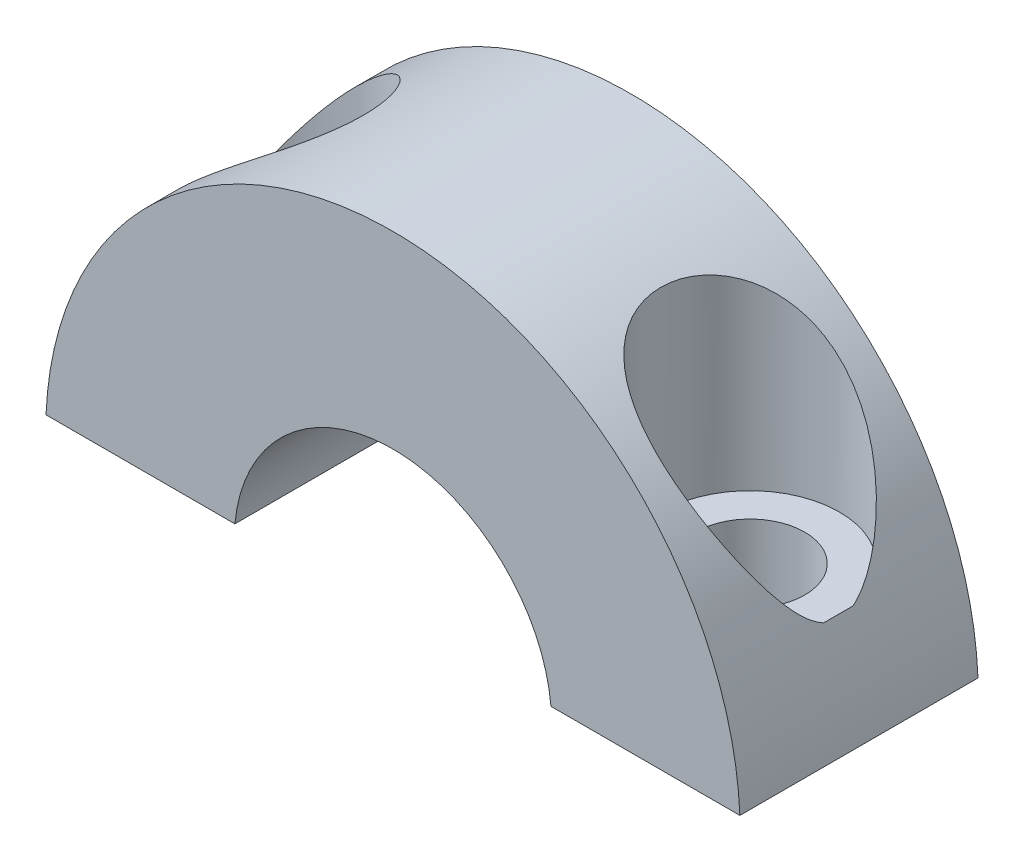
ISO-10303-21;
HEADER;
FILE_DESCRIPTION(('STEP AP214'),'2;1');
FILE_NAME('part.step','',(''),(''),'','','');
FILE_SCHEMA(('AUTOMOTIVE_DESIGN { 1 0 10303 214 1 1 1 1 }'));
ENDSEC;
DATA;
#1=APPLICATION_CONTEXT('core data for automotive mechanical design processes');
#2=APPLICATION_PROTOCOL_DEFINITION('international standard','automotive_design',2000,#1);
#3=PRODUCT_CONTEXT('',#1,'mechanical');
#4=PRODUCT('Part','Part','',(#3));
#5=PRODUCT_RELATED_PRODUCT_CATEGORY('part','',(#4));
#6=PRODUCT_DEFINITION_FORMATION('','',#4);
#7=PRODUCT_DEFINITION_CONTEXT('part definition',#1,'design');
#8=PRODUCT_DEFINITION('design','',#6,#7);
#9=PRODUCT_DEFINITION_SHAPE('','',#8);
#10=(LENGTH_UNIT() NAMED_UNIT(*) SI_UNIT(.MILLI.,.METRE.));
#11=(NAMED_UNIT(*) PLANE_ANGLE_UNIT() SI_UNIT($,.RADIAN.));
#12=(NAMED_UNIT(*) SI_UNIT($,.STERADIAN.) SOLID_ANGLE_UNIT());
#13=UNCERTAINTY_MEASURE_WITH_UNIT(LENGTH_MEASURE(1.E-05),#10,'distance_accuracy_value','');
#14=(GEOMETRIC_REPRESENTATION_CONTEXT(3) GLOBAL_UNCERTAINTY_ASSIGNED_CONTEXT((#13)) GLOBAL_UNIT_ASSIGNED_CONTEXT((#10,
#11,#12)) REPRESENTATION_CONTEXT('',''));
#15=CARTESIAN_POINT('',(0.,0.,0.));
#16=DIRECTION('',(0.,0.,1.));
#17=DIRECTION('',(1.,0.,0.));
#18=AXIS2_PLACEMENT_3D('',#15,#16,#17);
#19=CARTESIAN_POINT('',(12.,17.5,0.));
#20=DIRECTION('',(0.,-1.,0.));
#21=DIRECTION('',(0.,0.,-1.));
#22=AXIS2_PLACEMENT_3D('',#19,#20,#21);
#23=CYLINDRICAL_SURFACE('',#22,2.75);
#24=CARTESIAN_POINT('',(12.,0.75,0.));
#25=DIRECTION('',(0.,1.,0.));
#26=DIRECTION('',(0.,0.,-1.));
#27=AXIS2_PLACEMENT_3D('',#24,#25,#26);
#28=CIRCLE('',#27,2.75);
#29=CARTESIAN_POINT('',(12.,0.75,-2.75));
#30=VERTEX_POINT('',#29);
#31=EDGE_CURVE('E96',#30,#30,#28,.T.);
#32=ORIENTED_EDGE('',*,*,#31,.F.);
#33=EDGE_LOOP('',(#32));
#34=FACE_BOUND('',#33,.T.);
#35=CARTESIAN_POINT('',(12.,6.,0.));
#36=DIRECTION('',(0.,1.,0.));
#37=DIRECTION('',(0.,0.,1.));
#38=AXIS2_PLACEMENT_3D('',#35,#36,#37);
#39=CIRCLE('',#38,2.75);
#40=CARTESIAN_POINT('',(12.,6.,2.75));
#41=VERTEX_POINT('',#40);
#42=EDGE_CURVE('E97',#41,#41,#39,.T.);
#43=ORIENTED_EDGE('',*,*,#42,.T.);
#44=EDGE_LOOP('',(#43));
#45=FACE_BOUND('',#44,.T.);
#46=ADVANCED_FACE('F36',(#34,#45),#23,.F.);
#47=CARTESIAN_POINT('',(0.,0.,6.));
#48=DIRECTION('',(0.,0.,-1.));
#49=DIRECTION('',(-1.,0.,0.));
#50=AXIS2_PLACEMENT_3D('',#47,#48,#49);
#51=CYLINDRICAL_SURFACE('',#50,17.5);
#52=DIRECTION('',(0.,0.,-1.));
#53=VECTOR('',#52,1.);
#54=CARTESIAN_POINT('',(16.4392822227736,6.,6.));
#55=LINE('',#54,#53);
#56=CARTESIAN_POINT('',(16.4392822227736,6.,0.73673152950468));
#57=VERTEX_POINT('',#56);
#58=CARTESIAN_POINT('',(16.4392822227736,6.,-0.73673152950468));
#59=VERTEX_POINT('',#58);
#60=EDGE_CURVE('E93',#57,#59,#55,.T.);
#61=ORIENTED_EDGE('',*,*,#60,.F.);
#62=CARTESIAN_POINT('',(16.4392822227736,6.,0.73673152950468));
#63=CARTESIAN_POINT('',(16.4237276454729,6.04265099488966,0.830225824515092));
#64=CARTESIAN_POINT('',(16.4057972659105,6.09123608421873,0.920214409081327));
#65=CARTESIAN_POINT('',(16.3660572983246,6.1971954553876,1.09338109477788));
#66=CARTESIAN_POINT('',(16.3442670650469,6.25452569532411,1.17659028395688));
#67=CARTESIAN_POINT('',(16.2978346742346,6.37453577998822,1.33619290263014));
#68=CARTESIAN_POINT('',(16.2732359113949,6.43713110618408,1.41266439709946));
#69=CARTESIAN_POINT('',(16.2213400689768,6.56681182995872,1.56091575236651));
#70=CARTESIAN_POINT('',(16.1940388723436,6.633904026543,1.63268816913339));
#71=CARTESIAN_POINT('',(16.1101052379049,6.83632760739811,1.83809622494805));
#72=CARTESIAN_POINT('',(16.0501741709221,6.97612813602303,1.96596972656723));
#73=CARTESIAN_POINT('',(15.9226253445873,7.26255478153399,2.20949046879842));
#74=CARTESIAN_POINT('',(15.8550048041968,7.40918335651367,2.32513325657792));
#75=CARTESIAN_POINT('',(15.7117856419157,7.70828153077189,2.54761592055014));
#76=CARTESIAN_POINT('',(15.6361019032596,7.86079978292047,2.65433511309496));
#77=CARTESIAN_POINT('',(15.4777094251904,8.16825959814855,2.85871199105841));
#78=CARTESIAN_POINT('',(15.3949987983408,8.32320180313096,2.95636722704699));
#79=CARTESIAN_POINT('',(15.1739717864026,8.72226925786332,3.19617974321431));
#80=CARTESIAN_POINT('',(15.030653653368,8.96729381026282,3.3322854601932));
#81=CARTESIAN_POINT('',(14.7272817472177,9.4572897888088,3.58480785097009));
#82=CARTESIAN_POINT('',(14.5672196174061,9.70226112669154,3.70121461670047));
#83=CARTESIAN_POINT('',(14.2313430429311,10.1885103758385,3.91283801492244));
#84=CARTESIAN_POINT('',(14.0556133713277,10.4298007705745,4.00816000343201));
#85=CARTESIAN_POINT('',(13.6879984010532,10.907771863743,4.17629910749187));
#86=CARTESIAN_POINT('',(13.4961225920791,11.1444551705896,4.24912932636616));
#87=CARTESIAN_POINT('',(13.160441993415,11.5367502717061,4.35011993424196));
#88=CARTESIAN_POINT('',(13.0207880270996,11.6941763536398,4.38511966938922));
#89=CARTESIAN_POINT('',(12.7346560077365,12.0051295979292,4.44202121789002));
#90=CARTESIAN_POINT('',(12.5881796833305,12.1586577328727,4.46392632989327));
#91=CARTESIAN_POINT('',(12.289027159499,12.4609397394786,4.49322210900658));
#92=CARTESIAN_POINT('',(12.1363526449611,12.6096948891816,4.50061669398188));
#93=CARTESIAN_POINT('',(11.8256908618611,12.9014883643971,4.49930326751735));
#94=CARTESIAN_POINT('',(11.6677049133922,13.0445280913484,4.49059922857113));
#95=CARTESIAN_POINT('',(11.3834645948046,13.2926284310914,4.45931759208764));
#96=CARTESIAN_POINT('',(11.257997264034,13.399040697845,4.44026971005612));
#97=CARTESIAN_POINT('',(11.0054979214085,13.6071952882586,4.39061648743665));
#98=CARTESIAN_POINT('',(10.8784662846754,13.7089387048809,4.36001386741355));
#99=CARTESIAN_POINT('',(10.6239848958676,13.9070818855282,4.28650276717068));
#100=CARTESIAN_POINT('',(10.4965356808165,14.0034868291855,4.24360647361804));
#101=CARTESIAN_POINT('',(10.2423777651562,14.1904392735404,4.14479709867221));
#102=CARTESIAN_POINT('',(10.1156689424727,14.2809877661309,4.08888622894271));
#103=CARTESIAN_POINT('',(9.88623442664843,14.440512078305,3.97435200380782));
#104=CARTESIAN_POINT('',(9.78314954267313,14.510511112377,3.91786862248149));
#105=CARTESIAN_POINT('',(9.57951420558785,14.6457446927751,3.79543887112504));
#106=CARTESIAN_POINT('',(9.47896328390342,14.7109801242726,3.72949426596381));
#107=CARTESIAN_POINT('',(9.28143260893274,14.8363978638072,3.58805647426376));
#108=CARTESIAN_POINT('',(9.18445363743059,14.8965790692845,3.51256121324251));
#109=CARTESIAN_POINT('',(8.99528040501464,15.0115681509806,3.35216778280864));
#110=CARTESIAN_POINT('',(8.90308382327852,15.0663786452266,3.2672742381368));
#111=CARTESIAN_POINT('',(8.72402896807828,15.1707656499607,3.08774812789078));
#112=CARTESIAN_POINT('',(8.63720914118853,15.220305958219,2.99305604070124));
#113=CARTESIAN_POINT('',(8.47080824281327,15.3135398721257,2.79491213698804));
#114=CARTESIAN_POINT('',(8.3912239468202,15.3572360863195,2.69146426255631));
#115=CARTESIAN_POINT('',(8.24041753811837,15.4386808754502,2.47644564315421));
#116=CARTESIAN_POINT('',(8.16919518824745,15.4764296190802,2.36487512870425));
#117=CARTESIAN_POINT('',(8.03619712596018,15.5459052373545,2.13446827069719));
#118=CARTESIAN_POINT('',(7.97442034138189,15.5776327955598,2.01563275393406));
#119=CARTESIAN_POINT('',(7.86732991900521,15.6319650002494,1.78478394037446));
#120=CARTESIAN_POINT('',(7.82096180595222,15.6551826941068,1.67340236882465));
#121=CARTESIAN_POINT('',(7.73709881807539,15.696798895969,1.44647897073868));
#122=CARTESIAN_POINT('',(7.69960322717074,15.7151977929007,1.33093748080771));
#123=CARTESIAN_POINT('',(7.63396776679036,15.74718610759,1.09661443089428));
#124=CARTESIAN_POINT('',(7.60582516386778,15.7607769306008,0.977833828555276));
#125=CARTESIAN_POINT('',(7.55923772582817,15.7831744317913,0.737941872711953));
#126=CARTESIAN_POINT('',(7.54079263735009,15.7919812349604,0.616830580185863));
#127=CARTESIAN_POINT('',(7.51459181654283,15.8044647657159,0.380114727885456));
#128=CARTESIAN_POINT('',(7.50629319382445,15.8084021830144,0.264583595022166));
#129=CARTESIAN_POINT('',(7.49863185094869,15.8120377949991,0.0331185222107286));
#130=CARTESIAN_POINT('',(7.49927208096196,15.8117345901141,-0.0828155380977211));
#131=CARTESIAN_POINT('',(7.50948628706977,15.8068860688436,-0.314140276257693));
#132=CARTESIAN_POINT('',(7.51905571452073,15.8023429123417,-0.429531200711747));
#133=CARTESIAN_POINT('',(7.54701871345865,15.7890071906944,-0.65903385254756));
#134=CARTESIAN_POINT('',(7.5654155327403,15.7802130615126,-0.773145093278737));
#135=CARTESIAN_POINT('',(7.61054494849127,15.7584968614972,-0.997823171504758));
#136=CARTESIAN_POINT('',(7.63717157832271,15.7456272177612,-1.10841639543913));
#137=CARTESIAN_POINT('',(7.6985469759149,15.7157099506849,-1.32678935158116));
#138=CARTESIAN_POINT('',(7.73329866053026,15.6986608268251,-1.43456805790718));
#139=CARTESIAN_POINT('',(7.81052119308859,15.6603835542445,-1.64650599742359));
#140=CARTESIAN_POINT('',(7.85298890340354,15.6391571038922,-1.75066668140571));
#141=CARTESIAN_POINT('',(7.94520402907904,15.5925111203578,-1.95478347082582));
#142=CARTESIAN_POINT('',(7.99495415279654,15.5670900267226,-2.05473799409318));
#143=CARTESIAN_POINT('',(8.10208620395574,15.5116051290811,-2.25144734446039));
#144=CARTESIAN_POINT('',(8.15958257927517,15.4814703275429,-2.34811990252526));
#145=CARTESIAN_POINT('',(8.28090800737846,15.4169158646019,-2.53591710032178));
#146=CARTESIAN_POINT('',(8.34473934121942,15.3824946586292,-2.62703972246554));
#147=CARTESIAN_POINT('',(8.5446952676403,15.2728914496586,-2.89128670886612));
#148=CARTESIAN_POINT('',(8.68937552582446,15.1913223191764,-3.05545997620747));
#149=CARTESIAN_POINT('',(9.00416749159029,15.0069993151813,-3.36550240467514));
#150=CARTESIAN_POINT('',(9.17525595410588,14.9033066045158,-3.50980623948506));
#151=CARTESIAN_POINT('',(9.52939822876797,14.6793895529012,-3.76750869958269));
#152=CARTESIAN_POINT('',(9.71245611582089,14.5591595664172,-3.88089673116714));
#153=CARTESIAN_POINT('',(10.1064037190974,14.2889511027,-4.08896463144159));
#154=CARTESIAN_POINT('',(10.318024984957,14.1371360622474,-4.17984717701009));
#155=CARTESIAN_POINT('',(10.7417335500974,13.8179452387628,-4.32632588916303));
#156=CARTESIAN_POINT('',(10.9538210668359,13.6505590803054,-4.38189833185685));
#157=CARTESIAN_POINT('',(11.3236015036987,13.3442646288825,-4.45185882512426));
#158=CARTESIAN_POINT('',(11.4822933169695,13.2079868029628,-4.47287963203075));
#159=CARTESIAN_POINT('',(11.7954626467166,12.9290764842649,-4.49809375756375));
#160=CARTESIAN_POINT('',(11.949938408845,12.7864414092543,-4.50228017412239));
#161=CARTESIAN_POINT('',(12.2537251848941,12.4956207866205,-4.49541515573659));
#162=CARTESIAN_POINT('',(12.4030258679761,12.3474252427172,-4.48433485943828));
#163=CARTESIAN_POINT('',(12.6953613893165,12.0466510276101,-4.44838843377056));
#164=CARTESIAN_POINT('',(12.8383962951361,11.8940724036966,-4.42352245308619));
#165=CARTESIAN_POINT('',(13.1687905358772,11.528822460215,-4.34995736929301));
#166=CARTESIAN_POINT('',(13.3532276437559,11.3145828647393,-4.29586773096796));
#167=CARTESIAN_POINT('',(13.7087287532291,10.8811490680151,-4.16725362260937));
#168=CARTESIAN_POINT('',(13.8797867733232,10.6619527065228,-4.09272007890572));
#169=CARTESIAN_POINT('',(14.2082956428537,10.220088054008,-3.92523366287904));
#170=CARTESIAN_POINT('',(14.3657324563798,9.99741645430202,-3.83226210836105));
#171=CARTESIAN_POINT('',(14.6666327413291,9.55051875783088,-3.62932622998875));
#172=CARTESIAN_POINT('',(14.8101008206536,9.32629319999715,-3.51936754089527));
#173=CARTESIAN_POINT('',(15.0575528601493,8.91995739382151,-3.30498457780189));
#174=CARTESIAN_POINT('',(15.1639065405387,8.73780331146354,-3.203362653556));
#175=CARTESIAN_POINT('',(15.3673345991364,8.37486201198411,-2.98880087690397));
#176=CARTESIAN_POINT('',(15.4644056437717,8.19407530721823,-2.8758569881655));
#177=CARTESIAN_POINT('',(15.6490583298247,7.83565830065492,-2.6376383017847));
#178=CARTESIAN_POINT('',(15.7366384386446,7.65802851249693,-2.51236151883958));
#179=CARTESIAN_POINT('',(15.8604395233926,7.39633689619369,-2.31366843913484));
#180=CARTESIAN_POINT('',(15.9004326299867,7.3099273299638,-2.24566623983877));
#181=CARTESIAN_POINT('',(15.9777909620042,7.13925467558782,-2.10560863479963));
#182=CARTESIAN_POINT('',(16.0151567631006,7.054991119823,-2.03355412323173));
#183=CARTESIAN_POINT('',(16.0836648764008,6.89727473755041,-1.89189492704929));
#184=CARTESIAN_POINT('',(16.1150610195698,6.82355639848241,-1.82271001928606));
#185=CARTESIAN_POINT('',(16.1753500558912,6.67938226652648,-1.68001523475983));
#186=CARTESIAN_POINT('',(16.2042439631398,6.60892515738077,-1.60650713055807));
#187=CARTESIAN_POINT('',(16.2590498196958,6.47291557871531,-1.45497267503728));
#188=CARTESIAN_POINT('',(16.2849806992309,6.40733303239945,-1.37698042330325));
#189=CARTESIAN_POINT('',(16.3336072372909,6.28233682507168,-1.21530467083326));
#190=CARTESIAN_POINT('',(16.3563067417283,6.22291585396485,-1.13162811373498));
#191=CARTESIAN_POINT('',(16.3887689329249,6.13672266632773,-0.995616209614046));
#192=CARTESIAN_POINT('',(16.3998641998317,6.10699111729531,-0.945478830864919));
#193=CARTESIAN_POINT('',(16.4206729056732,6.05081889023851,-0.842851444874751));
#194=CARTESIAN_POINT('',(16.4303805339411,6.02439210536225,-0.790352689212285));
#195=CARTESIAN_POINT('',(16.4392822227736,6.00000000000001,-0.736731529504675));
#196=B_SPLINE_CURVE_WITH_KNOTS('',3,(#62,#63,#64,#65,#66,#67,#68,#69,#70,#71,#72,#73,#74,#75,
#76,#77,#78,#79,#80,#81,#82,#83,#84,#85,#86,#87,#88,#89,#90,#91,#92,#93,#94,#95,#96,#97,#98,#99,
#100,#101,#102,#103,#104,#105,#106,#107,#108,#109,#110,#111,#112,#113,#114,#115,#116,#117,#118,
#119,#120,#121,#122,#123,#124,#125,#126,#127,#128,#129,#130,#131,#132,#133,#134,#135,#136,#137,
#138,#139,#140,#141,#142,#143,#144,#145,#146,#147,#148,#149,#150,#151,#152,#153,#154,#155,#156,
#157,#158,#159,#160,#161,#162,#163,#164,#165,#166,#167,#168,#169,#170,#171,#172,#173,#174,#175,
#176,#177,#178,#179,#180,#181,#182,#183,#184,#185,#186,#187,#188,#189,#190,#191,#192,#193,#194,
#195),.UNSPECIFIED.,.F.,.F.,(4,2,2,2,2,2,2,2,2,2,2,2,2,2,2,2,2,2,2,2,2,2,2,2,2,2,2,2,2,2,2,2,2,
2,2,2,2,2,2,2,2,2,2,2,2,2,2,2,2,2,2,2,2,2,2,2,2,2,2,2,2,2,2,2,2,2,4),(0.,0.311026842318649,
0.620536087892699,0.925784109462638,1.2315045393327,1.82666154773725,2.42203449426583,
3.02446932958603,3.62706649485634,4.57032520594303,5.51405695088069,6.45296084433764,
7.39131671190227,8.03084256645953,8.67020725091674,9.30939928213267,9.94843360747812,
10.4448528399506,10.9411552632498,11.436967395753,11.9326953326479,12.3427217394948,
12.7526717604248,13.1627109793131,13.5725493140635,13.985042332573,14.3973506135285,
14.8096471977387,15.2218969475471,15.5900103977543,15.9580941282331,16.3260701900284,
16.6940366374597,17.041306017961,17.3886900136343,17.7358971441588,18.08323211801,
18.4262690548738,18.769429329911,19.112450374036,19.4555993146301,19.8045289990992,
20.1535847832658,20.8511042403723,21.5881670900068,22.3254821873313,23.1499778454694,
23.9750268755116,24.604899778594,25.2350309020479,25.866354909125,26.4976721072111,
27.3598901115196,28.222491417173,29.0859712551304,29.949165282875,30.6511327926588,
31.3533514531432,32.055683339558,32.4066088770159,32.7574572814642,33.0749059309953,
33.392225318176,33.7073882855915,34.0221729593324,34.2000437799085,34.3786388772292),.UNSPECIFIED.);
#197=EDGE_CURVE('E11',#57,#59,#196,.T.);
#198=ORIENTED_EDGE('',*,*,#197,.T.);
#199=EDGE_LOOP('',(#61,#198));
#200=FACE_BOUND('',#199,.T.);
#201=CARTESIAN_POINT('',(0.,0.,-6.));
#202=DIRECTION('',(0.,0.,1.));
#203=DIRECTION('',(1.,0.,0.));
#204=AXIS2_PLACEMENT_3D('',#201,#202,#203);
#205=CIRCLE('',#204,17.5);
#206=CARTESIAN_POINT('',(17.4839211849059,0.75,-6.));
#207=VERTEX_POINT('',#206);
#208=CARTESIAN_POINT('',(-17.4839211849059,0.75,-6.));
#209=VERTEX_POINT('',#208);
#210=EDGE_CURVE('E110',#207,#209,#205,.T.);
#211=ORIENTED_EDGE('',*,*,#210,.T.);
#212=DIRECTION('',(0.,0.,-1.));
#213=VECTOR('',#212,1.);
#214=CARTESIAN_POINT('',(-17.4839211849059,0.75,6.));
#215=LINE('',#214,#213);
#216=CARTESIAN_POINT('',(-17.4839211849059,0.75,6.));
#217=VERTEX_POINT('',#216);
#218=EDGE_CURVE('E115',#217,#209,#215,.T.);
#219=ORIENTED_EDGE('',*,*,#218,.F.);
#220=CARTESIAN_POINT('',(0.,0.,6.));
#221=DIRECTION('',(0.,0.,1.));
#222=DIRECTION('',(1.,0.,0.));
#223=AXIS2_PLACEMENT_3D('',#220,#221,#222);
#224=CIRCLE('',#223,17.5);
#225=CARTESIAN_POINT('',(17.4839211849059,0.75,6.));
#226=VERTEX_POINT('',#225);
#227=EDGE_CURVE('E252',#226,#217,#224,.T.);
#228=ORIENTED_EDGE('',*,*,#227,.F.);
#229=DIRECTION('',(0.,0.,-1.));
#230=VECTOR('',#229,1.);
#231=CARTESIAN_POINT('',(17.4839211849059,0.75,6.));
#232=LINE('',#231,#230);
#233=EDGE_CURVE('E262',#226,#207,#232,.T.);
#234=ORIENTED_EDGE('',*,*,#233,.T.);
#235=EDGE_LOOP('',(#211,#219,#228,#234));
#236=FACE_BOUND('',#235,.T.);
#237=CARTESIAN_POINT('',(-16.4392822227736,6.,0.73673152950468));
#238=CARTESIAN_POINT('',(-16.4237276454729,6.04265099488966,0.830225824515092));
#239=CARTESIAN_POINT('',(-16.4057972659105,6.09123608421873,0.920214409081327));
#240=CARTESIAN_POINT('',(-16.3660572983246,6.1971954553876,1.09338109477788));
#241=CARTESIAN_POINT('',(-16.3442670650469,6.25452569532411,1.17659028395688));
#242=CARTESIAN_POINT('',(-16.2978346742346,6.37453577998822,1.33619290263014));
#243=CARTESIAN_POINT('',(-16.2732359113949,6.43713110618408,1.41266439709946));
#244=CARTESIAN_POINT('',(-16.2213400689768,6.56681182995872,1.56091575236651));
#245=CARTESIAN_POINT('',(-16.1940388723436,6.633904026543,1.63268816913339));
#246=CARTESIAN_POINT('',(-16.1101052379049,6.83632760739811,1.83809622494805));
#247=CARTESIAN_POINT('',(-16.0501741709221,6.97612813602303,1.96596972656723));
#248=CARTESIAN_POINT('',(-15.9226253445873,7.26255478153399,2.20949046879842));
#249=CARTESIAN_POINT('',(-15.8550048041968,7.40918335651367,2.32513325657792));
#250=CARTESIAN_POINT('',(-15.7117856419157,7.70828153077189,2.54761592055014));
#251=CARTESIAN_POINT('',(-15.6361019032596,7.86079978292047,2.65433511309496));
#252=CARTESIAN_POINT('',(-15.4777094251904,8.16825959814855,2.85871199105841));
#253=CARTESIAN_POINT('',(-15.3949987983408,8.32320180313096,2.95636722704699));
#254=CARTESIAN_POINT('',(-15.1739717864026,8.72226925786332,3.19617974321431));
#255=CARTESIAN_POINT('',(-15.030653653368,8.96729381026282,3.3322854601932));
#256=CARTESIAN_POINT('',(-14.7272817472177,9.4572897888088,3.58480785097009));
#257=CARTESIAN_POINT('',(-14.5672196174061,9.70226112669154,3.70121461670047));
#258=CARTESIAN_POINT('',(-14.2313430429311,10.1885103758385,3.91283801492244));
#259=CARTESIAN_POINT('',(-14.0556133713277,10.4298007705745,4.00816000343201));
#260=CARTESIAN_POINT('',(-13.6879984010532,10.907771863743,4.17629910749187));
#261=CARTESIAN_POINT('',(-13.4961225920791,11.1444551705896,4.24912932636616));
#262=CARTESIAN_POINT('',(-13.160441993415,11.5367502717061,4.35011993424196));
#263=CARTESIAN_POINT('',(-13.0207880270996,11.6941763536398,4.38511966938922));
#264=CARTESIAN_POINT('',(-12.7346560077365,12.0051295979292,4.44202121789002));
#265=CARTESIAN_POINT('',(-12.5881796833305,12.1586577328727,4.46392632989327));
#266=CARTESIAN_POINT('',(-12.289027159499,12.4609397394786,4.49322210900658));
#267=CARTESIAN_POINT('',(-12.1363526449611,12.6096948891816,4.50061669398188));
#268=CARTESIAN_POINT('',(-11.8256908618611,12.9014883643971,4.49930326751735));
#269=CARTESIAN_POINT('',(-11.6677049133922,13.0445280913484,4.49059922857113));
#270=CARTESIAN_POINT('',(-11.3834645948046,13.2926284310914,4.45931759208764));
#271=CARTESIAN_POINT('',(-11.257997264034,13.399040697845,4.44026971005612));
#272=CARTESIAN_POINT('',(-11.0054979214085,13.6071952882586,4.39061648743665));
#273=CARTESIAN_POINT('',(-10.8784662846754,13.7089387048809,4.36001386741355));
#274=CARTESIAN_POINT('',(-10.6239848958676,13.9070818855282,4.28650276717068));
#275=CARTESIAN_POINT('',(-10.4965356808165,14.0034868291855,4.24360647361804));
#276=CARTESIAN_POINT('',(-10.2423777651562,14.1904392735404,4.14479709867221));
#277=CARTESIAN_POINT('',(-10.1156689424727,14.2809877661309,4.08888622894271));
#278=CARTESIAN_POINT('',(-9.88623442664843,14.440512078305,3.97435200380782));
#279=CARTESIAN_POINT('',(-9.78314954267313,14.510511112377,3.91786862248149));
#280=CARTESIAN_POINT('',(-9.57951420558785,14.6457446927751,3.79543887112504));
#281=CARTESIAN_POINT('',(-9.47896328390342,14.7109801242726,3.72949426596381));
#282=CARTESIAN_POINT('',(-9.28143260893274,14.8363978638072,3.58805647426376));
#283=CARTESIAN_POINT('',(-9.18445363743059,14.8965790692845,3.51256121324251));
#284=CARTESIAN_POINT('',(-8.99528040501464,15.0115681509806,3.35216778280864));
#285=CARTESIAN_POINT('',(-8.90308382327852,15.0663786452266,3.2672742381368));
#286=CARTESIAN_POINT('',(-8.72402896807828,15.1707656499607,3.08774812789078));
#287=CARTESIAN_POINT('',(-8.63720914118853,15.220305958219,2.99305604070124));
#288=CARTESIAN_POINT('',(-8.47080824281327,15.3135398721257,2.79491213698804));
#289=CARTESIAN_POINT('',(-8.3912239468202,15.3572360863195,2.69146426255631));
#290=CARTESIAN_POINT('',(-8.24041753811837,15.4386808754502,2.47644564315421));
#291=CARTESIAN_POINT('',(-8.16919518824745,15.4764296190802,2.36487512870425));
#292=CARTESIAN_POINT('',(-8.03619712596018,15.5459052373545,2.13446827069719));
#293=CARTESIAN_POINT('',(-7.97442034138189,15.5776327955598,2.01563275393406));
#294=CARTESIAN_POINT('',(-7.86732991900521,15.6319650002494,1.78478394037446));
#295=CARTESIAN_POINT('',(-7.82096180595222,15.6551826941068,1.67340236882465));
#296=CARTESIAN_POINT('',(-7.73709881807539,15.696798895969,1.44647897073868));
#297=CARTESIAN_POINT('',(-7.69960322717074,15.7151977929007,1.33093748080771));
#298=CARTESIAN_POINT('',(-7.63396776679036,15.74718610759,1.09661443089428));
#299=CARTESIAN_POINT('',(-7.60582516386778,15.7607769306008,0.977833828555276));
#300=CARTESIAN_POINT('',(-7.55923772582817,15.7831744317913,0.737941872711953));
#301=CARTESIAN_POINT('',(-7.54079263735009,15.7919812349604,0.616830580185863));
#302=CARTESIAN_POINT('',(-7.51459181654283,15.8044647657159,0.380114727885456));
#303=CARTESIAN_POINT('',(-7.50629319382445,15.8084021830144,0.264583595022166));
#304=CARTESIAN_POINT('',(-7.49863185094869,15.8120377949991,0.0331185222107286));
#305=CARTESIAN_POINT('',(-7.49927208096196,15.8117345901141,-0.0828155380977211));
#306=CARTESIAN_POINT('',(-7.50948628706977,15.8068860688436,-0.314140276257693));
#307=CARTESIAN_POINT('',(-7.51905571452073,15.8023429123417,-0.429531200711747));
#308=CARTESIAN_POINT('',(-7.54701871345865,15.7890071906944,-0.65903385254756));
#309=CARTESIAN_POINT('',(-7.5654155327403,15.7802130615126,-0.773145093278737));
#310=CARTESIAN_POINT('',(-7.61054494849127,15.7584968614972,-0.997823171504758));
#311=CARTESIAN_POINT('',(-7.63717157832271,15.7456272177612,-1.10841639543913));
#312=CARTESIAN_POINT('',(-7.6985469759149,15.7157099506849,-1.32678935158116));
#313=CARTESIAN_POINT('',(-7.73329866053026,15.6986608268251,-1.43456805790718));
#314=CARTESIAN_POINT('',(-7.81052119308859,15.6603835542445,-1.64650599742359));
#315=CARTESIAN_POINT('',(-7.85298890340354,15.6391571038922,-1.75066668140571));
#316=CARTESIAN_POINT('',(-7.94520402907904,15.5925111203578,-1.95478347082582));
#317=CARTESIAN_POINT('',(-7.99495415279654,15.5670900267226,-2.05473799409318));
#318=CARTESIAN_POINT('',(-8.10208620395574,15.5116051290811,-2.25144734446039));
#319=CARTESIAN_POINT('',(-8.15958257927517,15.4814703275429,-2.34811990252526));
#320=CARTESIAN_POINT('',(-8.28090800737846,15.4169158646019,-2.53591710032178));
#321=CARTESIAN_POINT('',(-8.34473934121942,15.3824946586292,-2.62703972246554));
#322=CARTESIAN_POINT('',(-8.5446952676403,15.2728914496586,-2.89128670886612));
#323=CARTESIAN_POINT('',(-8.68937552582446,15.1913223191764,-3.05545997620747));
#324=CARTESIAN_POINT('',(-9.00416749159029,15.0069993151813,-3.36550240467514));
#325=CARTESIAN_POINT('',(-9.17525595410588,14.9033066045158,-3.50980623948506));
#326=CARTESIAN_POINT('',(-9.52939822876797,14.6793895529012,-3.76750869958269));
#327=CARTESIAN_POINT('',(-9.71245611582089,14.5591595664172,-3.88089673116714));
#328=CARTESIAN_POINT('',(-10.1064037190974,14.2889511027,-4.08896463144159));
#329=CARTESIAN_POINT('',(-10.318024984957,14.1371360622474,-4.17984717701009));
#330=CARTESIAN_POINT('',(-10.7417335500974,13.8179452387628,-4.32632588916303));
#331=CARTESIAN_POINT('',(-10.9538210668359,13.6505590803054,-4.38189833185685));
#332=CARTESIAN_POINT('',(-11.3236015036987,13.3442646288825,-4.45185882512426));
#333=CARTESIAN_POINT('',(-11.4822933169695,13.2079868029628,-4.47287963203075));
#334=CARTESIAN_POINT('',(-11.7954626467166,12.9290764842649,-4.49809375756375));
#335=CARTESIAN_POINT('',(-11.949938408845,12.7864414092543,-4.50228017412239));
#336=CARTESIAN_POINT('',(-12.2537251848941,12.4956207866205,-4.49541515573659));
#337=CARTESIAN_POINT('',(-12.4030258679761,12.3474252427172,-4.48433485943828));
#338=CARTESIAN_POINT('',(-12.6953613893165,12.0466510276101,-4.44838843377056));
#339=CARTESIAN_POINT('',(-12.8383962951361,11.8940724036966,-4.42352245308619));
#340=CARTESIAN_POINT('',(-13.1687905358772,11.528822460215,-4.34995736929301));
#341=CARTESIAN_POINT('',(-13.3532276437559,11.3145828647393,-4.29586773096796));
#342=CARTESIAN_POINT('',(-13.7087287532291,10.8811490680151,-4.16725362260937));
#343=CARTESIAN_POINT('',(-13.8797867733232,10.6619527065228,-4.09272007890572));
#344=CARTESIAN_POINT('',(-14.2082956428537,10.220088054008,-3.92523366287904));
#345=CARTESIAN_POINT('',(-14.3657324563798,9.99741645430202,-3.83226210836105));
#346=CARTESIAN_POINT('',(-14.6666327413291,9.55051875783088,-3.62932622998875));
#347=CARTESIAN_POINT('',(-14.8101008206536,9.32629319999715,-3.51936754089527));
#348=CARTESIAN_POINT('',(-15.0575528601493,8.91995739382151,-3.30498457780189));
#349=CARTESIAN_POINT('',(-15.1639065405387,8.73780331146354,-3.203362653556));
#350=CARTESIAN_POINT('',(-15.3673345991364,8.37486201198411,-2.98880087690397));
#351=CARTESIAN_POINT('',(-15.4644056437717,8.19407530721823,-2.8758569881655));
#352=CARTESIAN_POINT('',(-15.6490583298247,7.83565830065492,-2.6376383017847));
#353=CARTESIAN_POINT('',(-15.7366384386446,7.65802851249693,-2.51236151883958));
#354=CARTESIAN_POINT('',(-15.8604395233926,7.39633689619369,-2.31366843913484));
#355=CARTESIAN_POINT('',(-15.9004326299867,7.3099273299638,-2.24566623983877));
#356=CARTESIAN_POINT('',(-15.9777909620042,7.13925467558782,-2.10560863479963));
#357=CARTESIAN_POINT('',(-16.0151567631006,7.054991119823,-2.03355412323173));
#358=CARTESIAN_POINT('',(-16.0836648764008,6.89727473755041,-1.89189492704929));
#359=CARTESIAN_POINT('',(-16.1150610195698,6.82355639848241,-1.82271001928606));
#360=CARTESIAN_POINT('',(-16.1753500558912,6.67938226652648,-1.68001523475983));
#361=CARTESIAN_POINT('',(-16.2042439631398,6.60892515738077,-1.60650713055807));
#362=CARTESIAN_POINT('',(-16.2590498196958,6.47291557871531,-1.45497267503728));
#363=CARTESIAN_POINT('',(-16.2849806992309,6.40733303239945,-1.37698042330325));
#364=CARTESIAN_POINT('',(-16.3336072372909,6.28233682507168,-1.21530467083326));
#365=CARTESIAN_POINT('',(-16.3563067417283,6.22291585396485,-1.13162811373498));
#366=CARTESIAN_POINT('',(-16.3887689329249,6.13672266632773,-0.995616209614046));
#367=CARTESIAN_POINT('',(-16.3998641998317,6.10699111729531,-0.945478830864919));
#368=CARTESIAN_POINT('',(-16.4206729056732,6.05081889023851,-0.842851444874751));
#369=CARTESIAN_POINT('',(-16.4303805339411,6.02439210536225,-0.790352689212285));
#370=CARTESIAN_POINT('',(-16.4392822227736,6.00000000000001,-0.736731529504675));
#371=B_SPLINE_CURVE_WITH_KNOTS('',3,(#237,#238,#239,#240,#241,#242,#243,#244,#245,#246,#247,
#248,#249,#250,#251,#252,#253,#254,#255,#256,#257,#258,#259,#260,#261,#262,#263,#264,#265,#266,
#267,#268,#269,#270,#271,#272,#273,#274,#275,#276,#277,#278,#279,#280,#281,#282,#283,#284,#285,
#286,#287,#288,#289,#290,#291,#292,#293,#294,#295,#296,#297,#298,#299,#300,#301,#302,#303,#304,
#305,#306,#307,#308,#309,#310,#311,#312,#313,#314,#315,#316,#317,#318,#319,#320,#321,#322,#323,
#324,#325,#326,#327,#328,#329,#330,#331,#332,#333,#334,#335,#336,#337,#338,#339,#340,#341,#342,
#343,#344,#345,#346,#347,#348,#349,#350,#351,#352,#353,#354,#355,#356,#357,#358,#359,#360,#361,
#362,#363,#364,#365,#366,#367,#368,#369,#370),.UNSPECIFIED.,.F.,.F.,(4,2,2,2,2,2,2,2,2,2,2,2,2,
2,2,2,2,2,2,2,2,2,2,2,2,2,2,2,2,2,2,2,2,2,2,2,2,2,2,2,2,2,2,2,2,2,2,2,2,2,2,2,2,2,2,2,2,2,2,2,2,
2,2,2,2,2,4),(0.,0.311026842318649,0.620536087892699,0.925784109462638,1.2315045393327,
1.82666154773725,2.42203449426583,3.02446932958603,3.62706649485634,4.57032520594303,
5.51405695088069,6.45296084433764,7.39131671190227,8.03084256645953,8.67020725091674,
9.30939928213267,9.94843360747812,10.4448528399506,10.9411552632498,11.436967395753,
11.9326953326479,12.3427217394948,12.7526717604248,13.1627109793131,13.5725493140635,
13.985042332573,14.3973506135285,14.8096471977387,15.2218969475471,15.5900103977543,
15.9580941282331,16.3260701900284,16.6940366374597,17.041306017961,17.3886900136343,
17.7358971441588,18.08323211801,18.4262690548738,18.769429329911,19.112450374036,
19.4555993146301,19.8045289990992,20.1535847832658,20.8511042403723,21.5881670900068,
22.3254821873313,23.1499778454694,23.9750268755116,24.604899778594,25.2350309020479,
25.866354909125,26.4976721072111,27.3598901115196,28.222491417173,29.0859712551304,
29.949165282875,30.6511327926588,31.3533514531432,32.055683339558,32.4066088770159,
32.7574572814642,33.0749059309953,33.392225318176,33.7073882855915,34.0221729593324,
34.2000437799085,34.3786388772292),.UNSPECIFIED.);
#372=CARTESIAN_POINT('',(-16.4392822227736,6.,0.73673152950468));
#373=VERTEX_POINT('',#372);
#374=CARTESIAN_POINT('',(-16.4392822227736,6.,-0.73673152950468));
#375=VERTEX_POINT('',#374);
#376=EDGE_CURVE('E50',#373,#375,#371,.T.);
#377=ORIENTED_EDGE('',*,*,#376,.F.);
#378=DIRECTION('',(0.,0.,-1.));
#379=VECTOR('',#378,1.);
#380=CARTESIAN_POINT('',(-16.4392822227736,6.,6.));
#381=LINE('',#380,#379);
#382=EDGE_CURVE('E113',#375,#373,#381,.F.);
#383=ORIENTED_EDGE('',*,*,#382,.F.);
#384=EDGE_LOOP('',(#377,#383));
#385=FACE_BOUND('',#384,.T.);
#386=ADVANCED_FACE('F38',(#200,#236,#385),#51,.T.);
#387=CARTESIAN_POINT('',(-12.,17.5,0.));
#388=DIRECTION('',(0.,-1.,0.));
#389=DIRECTION('',(0.,0.,-1.));
#390=AXIS2_PLACEMENT_3D('',#387,#388,#389);
#391=CYLINDRICAL_SURFACE('',#390,2.75);
#392=CARTESIAN_POINT('',(-12.,0.75,0.));
#393=DIRECTION('',(0.,-1.,0.));
#394=DIRECTION('',(0.,0.,-1.));
#395=AXIS2_PLACEMENT_3D('',#392,#393,#394);
#396=CIRCLE('',#395,2.75);
#397=CARTESIAN_POINT('',(-12.,0.75,-2.75));
#398=VERTEX_POINT('',#397);
#399=EDGE_CURVE('E244',#398,#398,#396,.T.);
#400=ORIENTED_EDGE('',*,*,#399,.T.);
#401=EDGE_LOOP('',(#400));
#402=FACE_BOUND('',#401,.T.);
#403=CARTESIAN_POINT('',(-12.,6.,0.));
#404=DIRECTION('',(0.,1.,0.));
#405=DIRECTION('',(0.,0.,1.));
#406=AXIS2_PLACEMENT_3D('',#403,#404,#405);
#407=CIRCLE('',#406,2.75);
#408=CARTESIAN_POINT('',(-12.,6.,2.75));
#409=VERTEX_POINT('',#408);
#410=EDGE_CURVE('E126',#409,#409,#407,.F.);
#411=ORIENTED_EDGE('',*,*,#410,.F.);
#412=EDGE_LOOP('',(#411));
#413=FACE_BOUND('',#412,.T.);
#414=ADVANCED_FACE('F104',(#402,#413),#391,.F.);
#415=CARTESIAN_POINT('',(-17.4839211849059,0.75,6.));
#416=DIRECTION('',(0.,1.,0.));
#417=DIRECTION('',(0.,0.,1.));
#418=AXIS2_PLACEMENT_3D('',#415,#416,#417);
#419=PLANE('',#418);
#420=ORIENTED_EDGE('',*,*,#399,.F.);
#421=EDGE_LOOP('',(#420));
#422=FACE_BOUND('',#421,.T.);
#423=DIRECTION('',(1.,0.,0.));
#424=VECTOR('',#423,1.);
#425=CARTESIAN_POINT('',(-17.4839211849059,0.75,-6.));
#426=LINE('',#425,#424);
#427=CARTESIAN_POINT('',(-7.964766161037,0.75,-6.));
#428=VERTEX_POINT('',#427);
#429=EDGE_CURVE('E264',#209,#428,#426,.T.);
#430=ORIENTED_EDGE('',*,*,#429,.T.);
#431=DIRECTION('',(0.,0.,-1.));
#432=VECTOR('',#431,1.);
#433=CARTESIAN_POINT('',(-7.964766161037,0.75,6.));
#434=LINE('',#433,#432);
#435=CARTESIAN_POINT('',(-7.964766161037,0.75,6.));
#436=VERTEX_POINT('',#435);
#437=EDGE_CURVE('E118',#436,#428,#434,.T.);
#438=ORIENTED_EDGE('',*,*,#437,.F.);
#439=DIRECTION('',(1.,0.,0.));
#440=VECTOR('',#439,1.);
#441=CARTESIAN_POINT('',(-17.4839211849059,0.75,6.));
#442=LINE('',#441,#440);
#443=EDGE_CURVE('E255',#217,#436,#442,.T.);
#444=ORIENTED_EDGE('',*,*,#443,.F.);
#445=ORIENTED_EDGE('',*,*,#218,.T.);
#446=EDGE_LOOP('',(#430,#438,#444,#445));
#447=FACE_BOUND('',#446,.T.);
#448=ADVANCED_FACE('F137',(#422,#447),#419,.F.);
#449=CARTESIAN_POINT('',(0.,0.,6.));
#450=DIRECTION('',(0.,0.,-1.));
#451=DIRECTION('',(-1.,0.,0.));
#452=AXIS2_PLACEMENT_3D('',#449,#450,#451);
#453=CYLINDRICAL_SURFACE('',#452,8.);
#454=CARTESIAN_POINT('',(0.,0.,-6.));
#455=DIRECTION('',(0.,0.,-1.));
#456=DIRECTION('',(1.,0.,0.));
#457=AXIS2_PLACEMENT_3D('',#454,#455,#456);
#458=CIRCLE('',#457,8.);
#459=CARTESIAN_POINT('',(7.964766161037,0.75,-6.));
#460=VERTEX_POINT('',#459);
#461=EDGE_CURVE('E266',#428,#460,#458,.T.);
#462=ORIENTED_EDGE('',*,*,#461,.T.);
#463=DIRECTION('',(0.,0.,-1.));
#464=VECTOR('',#463,1.);
#465=CARTESIAN_POINT('',(7.964766161037,0.75,6.));
#466=LINE('',#465,#464);
#467=CARTESIAN_POINT('',(7.964766161037,0.75,6.));
#468=VERTEX_POINT('',#467);
#469=EDGE_CURVE('E270',#468,#460,#466,.T.);
#470=ORIENTED_EDGE('',*,*,#469,.F.);
#471=CARTESIAN_POINT('',(0.,0.,6.));
#472=DIRECTION('',(0.,0.,-1.));
#473=DIRECTION('',(1.,0.,0.));
#474=AXIS2_PLACEMENT_3D('',#471,#472,#473);
#475=CIRCLE('',#474,8.);
#476=EDGE_CURVE('E258',#436,#468,#475,.T.);
#477=ORIENTED_EDGE('',*,*,#476,.F.);
#478=ORIENTED_EDGE('',*,*,#437,.T.);
#479=EDGE_LOOP('',(#462,#470,#477,#478));
#480=FACE_BOUND('',#479,.T.);
#481=ADVANCED_FACE('F149',(#480),#453,.F.);
#482=CARTESIAN_POINT('',(7.964766161037,0.75,6.));
#483=DIRECTION('',(0.,1.,0.));
#484=DIRECTION('',(0.,0.,1.));
#485=AXIS2_PLACEMENT_3D('',#482,#483,#484);
#486=PLANE('',#485);
#487=ORIENTED_EDGE('',*,*,#31,.T.);
#488=EDGE_LOOP('',(#487));
#489=FACE_BOUND('',#488,.T.);
#490=DIRECTION('',(1.,0.,0.));
#491=VECTOR('',#490,1.);
#492=CARTESIAN_POINT('',(7.964766161037,0.75,-6.));
#493=LINE('',#492,#491);
#494=EDGE_CURVE('E256',#460,#207,#493,.T.);
#495=ORIENTED_EDGE('',*,*,#494,.T.);
#496=ORIENTED_EDGE('',*,*,#233,.F.);
#497=DIRECTION('',(1.,0.,0.));
#498=VECTOR('',#497,1.);
#499=CARTESIAN_POINT('',(7.964766161037,0.75,6.));
#500=LINE('',#499,#498);
#501=EDGE_CURVE('E260',#468,#226,#500,.T.);
#502=ORIENTED_EDGE('',*,*,#501,.F.);
#503=ORIENTED_EDGE('',*,*,#469,.T.);
#504=EDGE_LOOP('',(#495,#496,#502,#503));
#505=FACE_BOUND('',#504,.T.);
#506=ADVANCED_FACE('F142',(#489,#505),#486,.F.);
#507=CARTESIAN_POINT('',(0.,0.,6.));
#508=DIRECTION('',(0.,0.,1.));
#509=DIRECTION('',(1.,0.,0.));
#510=AXIS2_PLACEMENT_3D('',#507,#508,#509);
#511=PLANE('',#510);
#512=ORIENTED_EDGE('',*,*,#227,.T.);
#513=ORIENTED_EDGE('',*,*,#443,.T.);
#514=ORIENTED_EDGE('',*,*,#476,.T.);
#515=ORIENTED_EDGE('',*,*,#501,.T.);
#516=EDGE_LOOP('',(#512,#513,#514,#515));
#517=FACE_BOUND('',#516,.T.);
#518=ADVANCED_FACE('F139',(#517),#511,.T.);
#519=CARTESIAN_POINT('',(0.,0.,-6.));
#520=DIRECTION('',(0.,0.,1.));
#521=DIRECTION('',(1.,0.,0.));
#522=AXIS2_PLACEMENT_3D('',#519,#520,#521);
#523=PLANE('',#522);
#524=ORIENTED_EDGE('',*,*,#210,.F.);
#525=ORIENTED_EDGE('',*,*,#494,.F.);
#526=ORIENTED_EDGE('',*,*,#461,.F.);
#527=ORIENTED_EDGE('',*,*,#429,.F.);
#528=EDGE_LOOP('',(#524,#525,#526,#527));
#529=FACE_BOUND('',#528,.T.);
#530=ADVANCED_FACE('F133',(#529),#523,.F.);
#531=CARTESIAN_POINT('',(-12.,17.5,0.));
#532=DIRECTION('',(0.,-1.,0.));
#533=DIRECTION('',(0.,0.,-1.));
#534=AXIS2_PLACEMENT_3D('',#531,#532,#533);
#535=CYLINDRICAL_SURFACE('',#534,4.5);
#536=ORIENTED_EDGE('',*,*,#376,.T.);
#537=CARTESIAN_POINT('',(-12.,6.,0.));
#538=DIRECTION('',(0.,1.,0.));
#539=DIRECTION('',(0.,0.,1.));
#540=AXIS2_PLACEMENT_3D('',#537,#538,#539);
#541=CIRCLE('',#540,4.5);
#542=EDGE_CURVE('E63',#373,#375,#541,.T.);
#543=ORIENTED_EDGE('',*,*,#542,.F.);
#544=EDGE_LOOP('',(#536,#543));
#545=FACE_BOUND('',#544,.T.);
#546=ADVANCED_FACE('F127',(#545),#535,.F.);
#547=CARTESIAN_POINT('',(-12.,6.,0.));
#548=DIRECTION('',(0.,1.,0.));
#549=DIRECTION('',(0.,0.,1.));
#550=AXIS2_PLACEMENT_3D('',#547,#548,#549);
#551=PLANE('',#550);
#552=ORIENTED_EDGE('',*,*,#410,.T.);
#553=EDGE_LOOP('',(#552));
#554=FACE_BOUND('',#553,.T.);
#555=ORIENTED_EDGE('',*,*,#382,.T.);
#556=ORIENTED_EDGE('',*,*,#542,.T.);
#557=EDGE_LOOP('',(#555,#556));
#558=FACE_BOUND('',#557,.T.);
#559=ADVANCED_FACE('F132',(#554,#558),#551,.T.);
#560=CARTESIAN_POINT('',(12.,17.5,0.));
#561=DIRECTION('',(0.,-1.,0.));
#562=DIRECTION('',(0.,0.,-1.));
#563=AXIS2_PLACEMENT_3D('',#560,#561,#562);
#564=CYLINDRICAL_SURFACE('',#563,4.5);
#565=CARTESIAN_POINT('',(12.,6.,0.));
#566=DIRECTION('',(0.,-1.,0.));
#567=DIRECTION('',(0.,0.,1.));
#568=AXIS2_PLACEMENT_3D('',#565,#566,#567);
#569=CIRCLE('',#568,4.5);
#570=EDGE_CURVE('E56',#57,#59,#569,.T.);
#571=ORIENTED_EDGE('',*,*,#570,.T.);
#572=ORIENTED_EDGE('',*,*,#197,.F.);
#573=EDGE_LOOP('',(#571,#572));
#574=FACE_BOUND('',#573,.T.);
#575=ADVANCED_FACE('F100',(#574),#564,.F.);
#576=CARTESIAN_POINT('',(12.,6.,0.));
#577=DIRECTION('',(0.,1.,0.));
#578=DIRECTION('',(0.,0.,1.));
#579=AXIS2_PLACEMENT_3D('',#576,#577,#578);
#580=PLANE('',#579);
#581=ORIENTED_EDGE('',*,*,#42,.F.);
#582=EDGE_LOOP('',(#581));
#583=FACE_BOUND('',#582,.T.);
#584=ORIENTED_EDGE('',*,*,#60,.T.);
#585=ORIENTED_EDGE('',*,*,#570,.F.);
#586=EDGE_LOOP('',(#584,#585));
#587=FACE_BOUND('',#586,.T.);
#588=ADVANCED_FACE('F94',(#583,#587),#580,.T.);
#589=CLOSED_SHELL('',(#46,#386,#414,#448,#481,#506,#518,#530,#546,#559,#575,#588));
#590=MANIFOLD_SOLID_BREP('B2',#589);
#591=ADVANCED_BREP_SHAPE_REPRESENTATION('',(#18,#590),#14);
#592=SHAPE_DEFINITION_REPRESENTATION(#9,#591);
ENDSEC;
END-ISO-10303-21;
